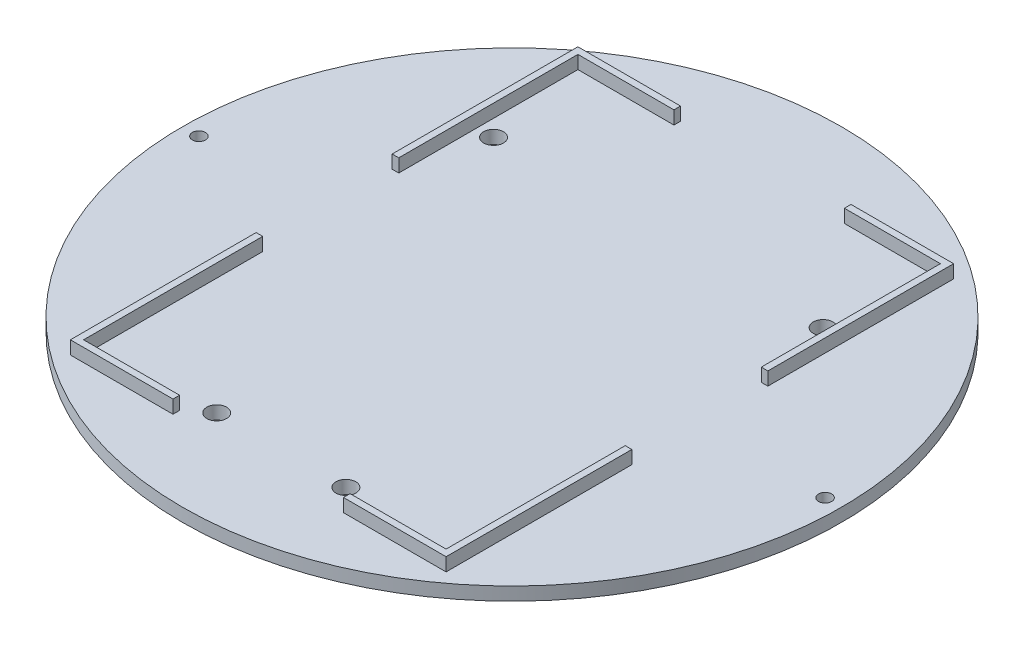
ISO-10303-21;
HEADER;
FILE_DESCRIPTION(('STEP AP214'),'2;1');
FILE_NAME('part.step','',(''),(''),'','','');
FILE_SCHEMA(('AUTOMOTIVE_DESIGN { 1 0 10303 214 1 1 1 1 }'));
ENDSEC;
DATA;
#1=APPLICATION_CONTEXT('core data for automotive mechanical design processes');
#2=APPLICATION_PROTOCOL_DEFINITION('international standard','automotive_design',2000,#1);
#3=PRODUCT_CONTEXT('',#1,'mechanical');
#4=PRODUCT('Part','Part','',(#3));
#5=PRODUCT_RELATED_PRODUCT_CATEGORY('part','',(#4));
#6=PRODUCT_DEFINITION_FORMATION('','',#4);
#7=PRODUCT_DEFINITION_CONTEXT('part definition',#1,'design');
#8=PRODUCT_DEFINITION('design','',#6,#7);
#9=PRODUCT_DEFINITION_SHAPE('','',#8);
#10=(LENGTH_UNIT() NAMED_UNIT(*) SI_UNIT(.MILLI.,.METRE.));
#11=(NAMED_UNIT(*) PLANE_ANGLE_UNIT() SI_UNIT($,.RADIAN.));
#12=(NAMED_UNIT(*) SI_UNIT($,.STERADIAN.) SOLID_ANGLE_UNIT());
#13=UNCERTAINTY_MEASURE_WITH_UNIT(LENGTH_MEASURE(1.E-05),#10,'distance_accuracy_value','');
#14=(GEOMETRIC_REPRESENTATION_CONTEXT(3) GLOBAL_UNCERTAINTY_ASSIGNED_CONTEXT((#13)) GLOBAL_UNIT_ASSIGNED_CONTEXT((#10,
#11,#12)) REPRESENTATION_CONTEXT('',''));
#15=CARTESIAN_POINT('',(0.,0.,0.));
#16=DIRECTION('',(0.,0.,1.));
#17=DIRECTION('',(1.,0.,0.));
#18=AXIS2_PLACEMENT_3D('',#15,#16,#17);
#19=CARTESIAN_POINT('',(0.,4.,0.));
#20=DIRECTION('',(0.,-1.,0.));
#21=DIRECTION('',(0.,0.,-1.));
#22=AXIS2_PLACEMENT_3D('',#19,#20,#21);
#23=PLANE('',#22);
#24=DIRECTION('',(1.,0.,0.));
#25=VECTOR('',#24,1.);
#26=CARTESIAN_POINT('',(-27.5,4.,37.5));
#27=LINE('',#26,#25);
#28=CARTESIAN_POINT('',(12.9330413510101,4.,37.5));
#29=VERTEX_POINT('',#28);
#30=CARTESIAN_POINT('',(27.5,4.,37.5));
#31=VERTEX_POINT('',#30);
#32=EDGE_CURVE('E430',#29,#31,#27,.T.);
#33=ORIENTED_EDGE('',*,*,#32,.F.);
#34=DIRECTION('',(0.,0.,-1.));
#35=VECTOR('',#34,1.);
#36=CARTESIAN_POINT('',(12.9330413510101,4.,47.0176577194358));
#37=LINE('',#36,#35);
#38=CARTESIAN_POINT('',(12.9330413510101,4.,38.5));
#39=VERTEX_POINT('',#38);
#40=EDGE_CURVE('E404',#39,#29,#37,.T.);
#41=ORIENTED_EDGE('',*,*,#40,.F.);
#42=DIRECTION('',(1.,0.,0.));
#43=VECTOR('',#42,1.);
#44=CARTESIAN_POINT('',(-28.5,4.,38.5));
#45=LINE('',#44,#43);
#46=CARTESIAN_POINT('',(28.5,4.,38.5));
#47=VERTEX_POINT('',#46);
#48=EDGE_CURVE('E394',#39,#47,#45,.T.);
#49=ORIENTED_EDGE('',*,*,#48,.T.);
#50=DIRECTION('',(0.,0.,-1.));
#51=VECTOR('',#50,1.);
#52=CARTESIAN_POINT('',(28.5,4.,38.5));
#53=LINE('',#52,#51);
#54=CARTESIAN_POINT('',(28.5,4.,10.3209492554859));
#55=VERTEX_POINT('',#54);
#56=EDGE_CURVE('E223',#47,#55,#53,.T.);
#57=ORIENTED_EDGE('',*,*,#56,.T.);
#58=DIRECTION('',(1.,0.,0.));
#59=VECTOR('',#58,1.);
#60=CARTESIAN_POINT('',(-42.3668595981365,4.,10.3209492554859));
#61=LINE('',#60,#59);
#62=CARTESIAN_POINT('',(27.5,4.,10.3209492554859));
#63=VERTEX_POINT('',#62);
#64=EDGE_CURVE('E446',#63,#55,#61,.T.);
#65=ORIENTED_EDGE('',*,*,#64,.F.);
#66=DIRECTION('',(0.,0.,-1.));
#67=VECTOR('',#66,1.);
#68=CARTESIAN_POINT('',(27.5,4.,37.5));
#69=LINE('',#68,#67);
#70=EDGE_CURVE('E421',#31,#63,#69,.T.);
#71=ORIENTED_EDGE('',*,*,#70,.F.);
#72=EDGE_LOOP('',(#33,#41,#49,#57,#65,#71));
#73=FACE_BOUND('',#72,.T.);
#74=ADVANCED_FACE('F37',(#73),#23,.F.);
#75=DIRECTION('',(-1.,0.,0.));
#76=VECTOR('',#75,1.);
#77=CARTESIAN_POINT('',(-28.5,4.,-38.5));
#78=LINE('',#77,#76);
#79=CARTESIAN_POINT('',(28.5,4.,-38.5));
#80=VERTEX_POINT('',#79);
#81=CARTESIAN_POINT('',(12.9330413510101,4.,-38.5));
#82=VERTEX_POINT('',#81);
#83=EDGE_CURVE('E222',#80,#82,#78,.T.);
#84=ORIENTED_EDGE('',*,*,#83,.T.);
#85=CARTESIAN_POINT('',(12.9330413510101,4.,-37.5));
#86=VERTEX_POINT('',#85);
#87=EDGE_CURVE('E493',#86,#82,#37,.T.);
#88=ORIENTED_EDGE('',*,*,#87,.F.);
#89=DIRECTION('',(-1.,0.,0.));
#90=VECTOR('',#89,1.);
#91=CARTESIAN_POINT('',(-27.5,4.,-37.5));
#92=LINE('',#91,#90);
#93=CARTESIAN_POINT('',(27.5,4.,-37.5));
#94=VERTEX_POINT('',#93);
#95=EDGE_CURVE('E424',#94,#86,#92,.T.);
#96=ORIENTED_EDGE('',*,*,#95,.F.);
#97=CARTESIAN_POINT('',(27.5,4.,-10.3209492554859));
#98=VERTEX_POINT('',#97);
#99=EDGE_CURVE('E380',#98,#94,#69,.T.);
#100=ORIENTED_EDGE('',*,*,#99,.F.);
#101=DIRECTION('',(-1.,0.,0.));
#102=VECTOR('',#101,1.);
#103=CARTESIAN_POINT('',(-42.3668595981365,4.,-10.3209492554859));
#104=LINE('',#103,#102);
#105=CARTESIAN_POINT('',(28.5,4.,-10.3209492554859));
#106=VERTEX_POINT('',#105);
#107=EDGE_CURVE('E448',#106,#98,#104,.T.);
#108=ORIENTED_EDGE('',*,*,#107,.F.);
#109=EDGE_CURVE('E227',#106,#80,#53,.T.);
#110=ORIENTED_EDGE('',*,*,#109,.T.);
#111=EDGE_LOOP('',(#84,#88,#96,#100,#108,#110));
#112=FACE_BOUND('',#111,.T.);
#113=ADVANCED_FACE('F281',(#112),#23,.F.);
#114=CARTESIAN_POINT('',(-28.5,4.,38.5));
#115=DIRECTION('',(0.,0.,-1.));
#116=DIRECTION('',(-1.,0.,0.));
#117=AXIS2_PLACEMENT_3D('',#114,#115,#116);
#118=PLANE('',#117);
#119=ORIENTED_EDGE('',*,*,#48,.F.);
#120=DIRECTION('',(0.,-1.,0.));
#121=VECTOR('',#120,1.);
#122=CARTESIAN_POINT('',(12.9330413510101,4.,38.5));
#123=LINE('',#122,#121);
#124=CARTESIAN_POINT('',(12.9330413510101,2.,38.5));
#125=VERTEX_POINT('',#124);
#126=EDGE_CURVE('E480',#39,#125,#123,.T.);
#127=ORIENTED_EDGE('',*,*,#126,.T.);
#128=DIRECTION('',(1.,0.,0.));
#129=VECTOR('',#128,1.);
#130=CARTESIAN_POINT('',(-28.5,2.,38.5));
#131=LINE('',#130,#129);
#132=CARTESIAN_POINT('',(28.5,2.,38.5));
#133=VERTEX_POINT('',#132);
#134=EDGE_CURVE('E234',#125,#133,#131,.T.);
#135=ORIENTED_EDGE('',*,*,#134,.T.);
#136=DIRECTION('',(0.,-1.,0.));
#137=VECTOR('',#136,1.);
#138=CARTESIAN_POINT('',(28.5,4.,38.5));
#139=LINE('',#138,#137);
#140=EDGE_CURVE('E252',#47,#133,#139,.T.);
#141=ORIENTED_EDGE('',*,*,#140,.F.);
#142=EDGE_LOOP('',(#119,#127,#135,#141));
#143=FACE_BOUND('',#142,.T.);
#144=ADVANCED_FACE('F286',(#143),#118,.F.);
#145=CARTESIAN_POINT('',(-28.5,4.,-38.5));
#146=DIRECTION('',(0.,0.,1.));
#147=DIRECTION('',(1.,0.,0.));
#148=AXIS2_PLACEMENT_3D('',#145,#146,#147);
#149=PLANE('',#148);
#150=DIRECTION('',(-1.,0.,0.));
#151=VECTOR('',#150,1.);
#152=CARTESIAN_POINT('',(-28.5,2.,-38.5));
#153=LINE('',#152,#151);
#154=CARTESIAN_POINT('',(28.5,2.,-38.5));
#155=VERTEX_POINT('',#154);
#156=CARTESIAN_POINT('',(12.9330413510101,2.,-38.5));
#157=VERTEX_POINT('',#156);
#158=EDGE_CURVE('E244',#155,#157,#153,.T.);
#159=ORIENTED_EDGE('',*,*,#158,.T.);
#160=DIRECTION('',(0.,1.,0.));
#161=VECTOR('',#160,1.);
#162=CARTESIAN_POINT('',(12.9330413510101,4.,-38.5));
#163=LINE('',#162,#161);
#164=EDGE_CURVE('E482',#157,#82,#163,.T.);
#165=ORIENTED_EDGE('',*,*,#164,.T.);
#166=ORIENTED_EDGE('',*,*,#83,.F.);
#167=DIRECTION('',(0.,-1.,0.));
#168=VECTOR('',#167,1.);
#169=CARTESIAN_POINT('',(28.5,4.,-38.5));
#170=LINE('',#169,#168);
#171=EDGE_CURVE('E249',#80,#155,#170,.T.);
#172=ORIENTED_EDGE('',*,*,#171,.T.);
#173=EDGE_LOOP('',(#159,#165,#166,#172));
#174=FACE_BOUND('',#173,.T.);
#175=ADVANCED_FACE('F296',(#174),#149,.F.);
#176=CARTESIAN_POINT('',(-27.5,4.,-37.5));
#177=DIRECTION('',(0.,0.,1.));
#178=DIRECTION('',(1.,0.,0.));
#179=AXIS2_PLACEMENT_3D('',#176,#177,#178);
#180=PLANE('',#179);
#181=DIRECTION('',(0.,1.,0.));
#182=VECTOR('',#181,1.);
#183=CARTESIAN_POINT('',(12.9330413510101,4.,-37.5));
#184=LINE('',#183,#182);
#185=CARTESIAN_POINT('',(12.9330413510101,2.,-37.5));
#186=VERTEX_POINT('',#185);
#187=EDGE_CURVE('E485',#186,#86,#184,.T.);
#188=ORIENTED_EDGE('',*,*,#187,.F.);
#189=DIRECTION('',(-1.,0.,0.));
#190=VECTOR('',#189,1.);
#191=CARTESIAN_POINT('',(-27.5,2.,-37.5));
#192=LINE('',#191,#190);
#193=CARTESIAN_POINT('',(27.5,2.,-37.5));
#194=VERTEX_POINT('',#193);
#195=EDGE_CURVE('E358',#194,#186,#192,.T.);
#196=ORIENTED_EDGE('',*,*,#195,.F.);
#197=DIRECTION('',(0.,-1.,0.));
#198=VECTOR('',#197,1.);
#199=CARTESIAN_POINT('',(27.5,4.,-37.5));
#200=LINE('',#199,#198);
#201=EDGE_CURVE('E391',#94,#194,#200,.T.);
#202=ORIENTED_EDGE('',*,*,#201,.F.);
#203=ORIENTED_EDGE('',*,*,#95,.T.);
#204=EDGE_LOOP('',(#188,#196,#202,#203));
#205=FACE_BOUND('',#204,.T.);
#206=ADVANCED_FACE('F565',(#205),#180,.T.);
#207=CARTESIAN_POINT('',(-27.5,4.,37.5));
#208=DIRECTION('',(0.,0.,-1.));
#209=DIRECTION('',(-1.,0.,0.));
#210=AXIS2_PLACEMENT_3D('',#207,#208,#209);
#211=PLANE('',#210);
#212=DIRECTION('',(0.,-1.,0.));
#213=VECTOR('',#212,1.);
#214=CARTESIAN_POINT('',(12.9330413510101,4.,37.5));
#215=LINE('',#214,#213);
#216=CARTESIAN_POINT('',(12.9330413510101,2.,37.5));
#217=VERTEX_POINT('',#216);
#218=EDGE_CURVE('E439',#29,#217,#215,.T.);
#219=ORIENTED_EDGE('',*,*,#218,.F.);
#220=ORIENTED_EDGE('',*,*,#32,.T.);
#221=DIRECTION('',(0.,-1.,0.));
#222=VECTOR('',#221,1.);
#223=CARTESIAN_POINT('',(27.5,4.,37.5));
#224=LINE('',#223,#222);
#225=CARTESIAN_POINT('',(27.5,2.,37.5));
#226=VERTEX_POINT('',#225);
#227=EDGE_CURVE('E381',#31,#226,#224,.T.);
#228=ORIENTED_EDGE('',*,*,#227,.T.);
#229=DIRECTION('',(1.,0.,0.));
#230=VECTOR('',#229,1.);
#231=CARTESIAN_POINT('',(-27.5,2.,37.5));
#232=LINE('',#231,#230);
#233=EDGE_CURVE('E377',#217,#226,#232,.T.);
#234=ORIENTED_EDGE('',*,*,#233,.F.);
#235=EDGE_LOOP('',(#219,#220,#228,#234));
#236=FACE_BOUND('',#235,.T.);
#237=ADVANCED_FACE('F323',(#236),#211,.T.);
#238=CARTESIAN_POINT('',(-28.5,4.,38.5));
#239=VERTEX_POINT('',#238);
#240=CARTESIAN_POINT('',(-12.9330413510101,4.,38.5));
#241=VERTEX_POINT('',#240);
#242=EDGE_CURVE('E395',#239,#241,#45,.T.);
#243=ORIENTED_EDGE('',*,*,#242,.T.);
#244=DIRECTION('',(0.,0.,1.));
#245=VECTOR('',#244,1.);
#246=CARTESIAN_POINT('',(-12.9330413510101,4.,47.0176577194358));
#247=LINE('',#246,#245);
#248=CARTESIAN_POINT('',(-12.9330413510101,4.,37.5));
#249=VERTEX_POINT('',#248);
#250=EDGE_CURVE('E216',#249,#241,#247,.T.);
#251=ORIENTED_EDGE('',*,*,#250,.F.);
#252=CARTESIAN_POINT('',(-27.5,4.,37.5));
#253=VERTEX_POINT('',#252);
#254=EDGE_CURVE('E385',#253,#249,#27,.T.);
#255=ORIENTED_EDGE('',*,*,#254,.F.);
#256=DIRECTION('',(0.,0.,1.));
#257=VECTOR('',#256,1.);
#258=CARTESIAN_POINT('',(-27.5,4.,37.5));
#259=LINE('',#258,#257);
#260=CARTESIAN_POINT('',(-27.5,4.,10.3209492554859));
#261=VERTEX_POINT('',#260);
#262=EDGE_CURVE('E427',#261,#253,#259,.T.);
#263=ORIENTED_EDGE('',*,*,#262,.F.);
#264=CARTESIAN_POINT('',(-28.5,4.,10.3209492554859));
#265=VERTEX_POINT('',#264);
#266=EDGE_CURVE('E447',#265,#261,#61,.T.);
#267=ORIENTED_EDGE('',*,*,#266,.F.);
#268=DIRECTION('',(0.,0.,1.));
#269=VECTOR('',#268,1.);
#270=CARTESIAN_POINT('',(-28.5,4.,38.5));
#271=LINE('',#270,#269);
#272=EDGE_CURVE('E247',#265,#239,#271,.T.);
#273=ORIENTED_EDGE('',*,*,#272,.T.);
#274=EDGE_LOOP('',(#243,#251,#255,#263,#267,#273));
#275=FACE_BOUND('',#274,.T.);
#276=ADVANCED_FACE('F274',(#275),#23,.F.);
#277=CARTESIAN_POINT('',(-28.5,4.,38.5));
#278=DIRECTION('',(1.,0.,0.));
#279=DIRECTION('',(0.,0.,-1.));
#280=AXIS2_PLACEMENT_3D('',#277,#278,#279);
#281=PLANE('',#280);
#282=ORIENTED_EDGE('',*,*,#272,.F.);
#283=DIRECTION('',(0.,-1.,0.));
#284=VECTOR('',#283,1.);
#285=CARTESIAN_POINT('',(-28.5,4.,10.3209492554859));
#286=LINE('',#285,#284);
#287=CARTESIAN_POINT('',(-28.5,2.,10.3209492554859));
#288=VERTEX_POINT('',#287);
#289=EDGE_CURVE('E412',#265,#288,#286,.T.);
#290=ORIENTED_EDGE('',*,*,#289,.T.);
#291=DIRECTION('',(0.,0.,1.));
#292=VECTOR('',#291,1.);
#293=CARTESIAN_POINT('',(-28.5,2.,38.5));
#294=LINE('',#293,#292);
#295=CARTESIAN_POINT('',(-28.5,2.,38.5));
#296=VERTEX_POINT('',#295);
#297=EDGE_CURVE('E235',#288,#296,#294,.T.);
#298=ORIENTED_EDGE('',*,*,#297,.T.);
#299=DIRECTION('',(0.,-1.,0.));
#300=VECTOR('',#299,1.);
#301=CARTESIAN_POINT('',(-28.5,4.,38.5));
#302=LINE('',#301,#300);
#303=EDGE_CURVE('E255',#239,#296,#302,.T.);
#304=ORIENTED_EDGE('',*,*,#303,.F.);
#305=EDGE_LOOP('',(#282,#290,#298,#304));
#306=FACE_BOUND('',#305,.T.);
#307=ADVANCED_FACE('F306',(#306),#281,.F.);
#308=CARTESIAN_POINT('',(28.5,4.,38.5));
#309=DIRECTION('',(-1.,0.,0.));
#310=DIRECTION('',(0.,0.,1.));
#311=AXIS2_PLACEMENT_3D('',#308,#309,#310);
#312=PLANE('',#311);
#313=DIRECTION('',(0.,0.,-1.));
#314=VECTOR('',#313,1.);
#315=CARTESIAN_POINT('',(28.5,2.,38.5));
#316=LINE('',#315,#314);
#317=CARTESIAN_POINT('',(28.5,2.,10.3209492554859));
#318=VERTEX_POINT('',#317);
#319=EDGE_CURVE('E240',#133,#318,#316,.T.);
#320=ORIENTED_EDGE('',*,*,#319,.T.);
#321=DIRECTION('',(0.,1.,0.));
#322=VECTOR('',#321,1.);
#323=CARTESIAN_POINT('',(28.5,4.,10.3209492554859));
#324=LINE('',#323,#322);
#325=EDGE_CURVE('E409',#318,#55,#324,.T.);
#326=ORIENTED_EDGE('',*,*,#325,.T.);
#327=ORIENTED_EDGE('',*,*,#56,.F.);
#328=ORIENTED_EDGE('',*,*,#140,.T.);
#329=EDGE_LOOP('',(#320,#326,#327,#328));
#330=FACE_BOUND('',#329,.T.);
#331=ADVANCED_FACE('F301',(#330),#312,.F.);
#332=CARTESIAN_POINT('',(27.5,4.,37.5));
#333=DIRECTION('',(-1.,0.,0.));
#334=DIRECTION('',(0.,0.,1.));
#335=AXIS2_PLACEMENT_3D('',#332,#333,#334);
#336=PLANE('',#335);
#337=DIRECTION('',(0.,1.,0.));
#338=VECTOR('',#337,1.);
#339=CARTESIAN_POINT('',(27.5,4.,10.3209492554859));
#340=LINE('',#339,#338);
#341=CARTESIAN_POINT('',(27.5,2.,10.3209492554859));
#342=VERTEX_POINT('',#341);
#343=EDGE_CURVE('E413',#342,#63,#340,.T.);
#344=ORIENTED_EDGE('',*,*,#343,.F.);
#345=DIRECTION('',(0.,0.,-1.));
#346=VECTOR('',#345,1.);
#347=CARTESIAN_POINT('',(27.5,2.,37.5));
#348=LINE('',#347,#346);
#349=EDGE_CURVE('E372',#226,#342,#348,.T.);
#350=ORIENTED_EDGE('',*,*,#349,.F.);
#351=ORIENTED_EDGE('',*,*,#227,.F.);
#352=ORIENTED_EDGE('',*,*,#70,.T.);
#353=EDGE_LOOP('',(#344,#350,#351,#352));
#354=FACE_BOUND('',#353,.T.);
#355=ADVANCED_FACE('F444',(#354),#336,.T.);
#356=CARTESIAN_POINT('',(-27.5,4.,37.5));
#357=DIRECTION('',(1.,0.,0.));
#358=DIRECTION('',(0.,0.,-1.));
#359=AXIS2_PLACEMENT_3D('',#356,#357,#358);
#360=PLANE('',#359);
#361=DIRECTION('',(0.,-1.,0.));
#362=VECTOR('',#361,1.);
#363=CARTESIAN_POINT('',(-27.5,4.,10.3209492554859));
#364=LINE('',#363,#362);
#365=CARTESIAN_POINT('',(-27.5,2.,10.3209492554859));
#366=VERTEX_POINT('',#365);
#367=EDGE_CURVE('E417',#261,#366,#364,.T.);
#368=ORIENTED_EDGE('',*,*,#367,.F.);
#369=ORIENTED_EDGE('',*,*,#262,.T.);
#370=DIRECTION('',(0.,-1.,0.));
#371=VECTOR('',#370,1.);
#372=CARTESIAN_POINT('',(-27.5,4.,37.5));
#373=LINE('',#372,#371);
#374=CARTESIAN_POINT('',(-27.5,2.,37.5));
#375=VERTEX_POINT('',#374);
#376=EDGE_CURVE('E384',#253,#375,#373,.T.);
#377=ORIENTED_EDGE('',*,*,#376,.T.);
#378=DIRECTION('',(0.,0.,1.));
#379=VECTOR('',#378,1.);
#380=CARTESIAN_POINT('',(-27.5,2.,37.5));
#381=LINE('',#380,#379);
#382=EDGE_CURVE('E367',#366,#375,#381,.T.);
#383=ORIENTED_EDGE('',*,*,#382,.F.);
#384=EDGE_LOOP('',(#368,#369,#377,#383));
#385=FACE_BOUND('',#384,.T.);
#386=ADVANCED_FACE('F275',(#385),#360,.T.);
#387=CARTESIAN_POINT('',(0.,2.,0.));
#388=DIRECTION('',(0.,-1.,0.));
#389=DIRECTION('',(0.,0.,-1.));
#390=AXIS2_PLACEMENT_3D('',#387,#388,#389);
#391=CYLINDRICAL_SURFACE('',#390,50.);
#392=CARTESIAN_POINT('',(0.,2.,0.));
#393=DIRECTION('',(0.,1.,0.));
#394=DIRECTION('',(0.,0.,1.));
#395=AXIS2_PLACEMENT_3D('',#392,#393,#394);
#396=CIRCLE('',#395,50.);
#397=CARTESIAN_POINT('',(0.,2.,50.));
#398=VERTEX_POINT('',#397);
#399=EDGE_CURVE('E11',#398,#398,#396,.T.);
#400=ORIENTED_EDGE('',*,*,#399,.F.);
#401=EDGE_LOOP('',(#400));
#402=FACE_BOUND('',#401,.T.);
#403=CARTESIAN_POINT('',(0.,0.,0.));
#404=DIRECTION('',(0.,1.,0.));
#405=DIRECTION('',(0.,0.,1.));
#406=AXIS2_PLACEMENT_3D('',#403,#404,#405);
#407=CIRCLE('',#406,50.);
#408=CARTESIAN_POINT('',(0.,0.,50.));
#409=VERTEX_POINT('',#408);
#410=EDGE_CURVE('E41',#409,#409,#407,.T.);
#411=ORIENTED_EDGE('',*,*,#410,.T.);
#412=EDGE_LOOP('',(#411));
#413=FACE_BOUND('',#412,.T.);
#414=ADVANCED_FACE('F39',(#402,#413),#391,.T.);
#415=CARTESIAN_POINT('',(0.,0.,0.));
#416=DIRECTION('',(0.,1.,0.));
#417=DIRECTION('',(0.,0.,1.));
#418=AXIS2_PLACEMENT_3D('',#415,#416,#417);
#419=PLANE('',#418);
#420=CARTESIAN_POINT('',(-47.5,0.,0.));
#421=DIRECTION('',(0.,1.,0.));
#422=DIRECTION('',(0.,0.,1.));
#423=AXIS2_PLACEMENT_3D('',#420,#421,#422);
#424=CIRCLE('',#423,0.999999999999998);
#425=CARTESIAN_POINT('',(-47.5,0.,0.999999999999998));
#426=VERTEX_POINT('',#425);
#427=EDGE_CURVE('E512',#426,#426,#424,.T.);
#428=ORIENTED_EDGE('',*,*,#427,.T.);
#429=EDGE_LOOP('',(#428));
#430=FACE_BOUND('',#429,.T.);
#431=CARTESIAN_POINT('',(47.5,0.,0.));
#432=DIRECTION('',(0.,1.,0.));
#433=DIRECTION('',(0.,0.,1.));
#434=AXIS2_PLACEMENT_3D('',#431,#432,#433);
#435=CIRCLE('',#434,0.999999999999998);
#436=CARTESIAN_POINT('',(47.5,0.,0.999999999999998));
#437=VERTEX_POINT('',#436);
#438=EDGE_CURVE('E515',#437,#437,#435,.T.);
#439=ORIENTED_EDGE('',*,*,#438,.T.);
#440=EDGE_LOOP('',(#439));
#441=FACE_BOUND('',#440,.T.);
#442=CARTESIAN_POINT('',(25.,0.,-22.2));
#443=DIRECTION('',(0.,1.,0.));
#444=DIRECTION('',(0.,0.,1.));
#445=AXIS2_PLACEMENT_3D('',#442,#443,#444);
#446=CIRCLE('',#445,1.5);
#447=CARTESIAN_POINT('',(25.,0.,-20.7));
#448=VERTEX_POINT('',#447);
#449=EDGE_CURVE('E495',#448,#448,#446,.T.);
#450=ORIENTED_EDGE('',*,*,#449,.T.);
#451=EDGE_LOOP('',(#450));
#452=FACE_BOUND('',#451,.T.);
#453=CARTESIAN_POINT('',(-9.8,0.,35.));
#454=DIRECTION('',(0.,1.,0.));
#455=DIRECTION('',(0.,0.,1.));
#456=AXIS2_PLACEMENT_3D('',#453,#454,#455);
#457=CIRCLE('',#456,1.5);
#458=CARTESIAN_POINT('',(-9.8,0.,36.5));
#459=VERTEX_POINT('',#458);
#460=EDGE_CURVE('E500',#459,#459,#457,.T.);
#461=ORIENTED_EDGE('',*,*,#460,.T.);
#462=EDGE_LOOP('',(#461));
#463=FACE_BOUND('',#462,.T.);
#464=CARTESIAN_POINT('',(9.8,0.,35.));
#465=DIRECTION('',(0.,1.,0.));
#466=DIRECTION('',(0.,0.,1.));
#467=AXIS2_PLACEMENT_3D('',#464,#465,#466);
#468=CIRCLE('',#467,1.5);
#469=CARTESIAN_POINT('',(9.8,0.,36.5));
#470=VERTEX_POINT('',#469);
#471=EDGE_CURVE('E503',#470,#470,#468,.T.);
#472=ORIENTED_EDGE('',*,*,#471,.T.);
#473=EDGE_LOOP('',(#472));
#474=FACE_BOUND('',#473,.T.);
#475=CARTESIAN_POINT('',(-25.,0.,-22.2));
#476=DIRECTION('',(0.,1.,0.));
#477=DIRECTION('',(0.,0.,1.));
#478=AXIS2_PLACEMENT_3D('',#475,#476,#477);
#479=CIRCLE('',#478,1.5);
#480=CARTESIAN_POINT('',(-25.,0.,-20.7));
#481=VERTEX_POINT('',#480);
#482=EDGE_CURVE('E506',#481,#481,#479,.T.);
#483=ORIENTED_EDGE('',*,*,#482,.T.);
#484=EDGE_LOOP('',(#483));
#485=FACE_BOUND('',#484,.T.);
#486=ORIENTED_EDGE('',*,*,#410,.F.);
#487=EDGE_LOOP('',(#486));
#488=FACE_BOUND('',#487,.T.);
#489=ADVANCED_FACE('F265',(#430,#441,#452,#463,#474,#485,#488),#419,.F.);
#490=CARTESIAN_POINT('',(-12.9330413510101,4.,-37.5));
#491=VERTEX_POINT('',#490);
#492=CARTESIAN_POINT('',(-27.5,4.,-37.5));
#493=VERTEX_POINT('',#492);
#494=EDGE_CURVE('E214',#491,#493,#92,.T.);
#495=ORIENTED_EDGE('',*,*,#494,.F.);
#496=CARTESIAN_POINT('',(-12.9330413510101,4.,-38.5));
#497=VERTEX_POINT('',#496);
#498=EDGE_CURVE('E200',#497,#491,#247,.T.);
#499=ORIENTED_EDGE('',*,*,#498,.F.);
#500=CARTESIAN_POINT('',(-28.5,4.,-38.5));
#501=VERTEX_POINT('',#500);
#502=EDGE_CURVE('E211',#497,#501,#78,.T.);
#503=ORIENTED_EDGE('',*,*,#502,.T.);
#504=CARTESIAN_POINT('',(-28.5,4.,-10.3209492554859));
#505=VERTEX_POINT('',#504);
#506=EDGE_CURVE('E393',#501,#505,#271,.T.);
#507=ORIENTED_EDGE('',*,*,#506,.T.);
#508=CARTESIAN_POINT('',(-27.5,4.,-10.3209492554859));
#509=VERTEX_POINT('',#508);
#510=EDGE_CURVE('E451',#509,#505,#104,.T.);
#511=ORIENTED_EDGE('',*,*,#510,.F.);
#512=EDGE_CURVE('E428',#493,#509,#259,.T.);
#513=ORIENTED_EDGE('',*,*,#512,.F.);
#514=EDGE_LOOP('',(#495,#499,#503,#507,#511,#513));
#515=FACE_BOUND('',#514,.T.);
#516=ADVANCED_FACE('F209',(#515),#23,.F.);
#517=CARTESIAN_POINT('',(-28.5,2.,-38.5));
#518=VERTEX_POINT('',#517);
#519=CARTESIAN_POINT('',(-28.5,2.,-10.3209492554859));
#520=VERTEX_POINT('',#519);
#521=EDGE_CURVE('E231',#518,#520,#294,.T.);
#522=ORIENTED_EDGE('',*,*,#521,.T.);
#523=DIRECTION('',(0.,1.,0.));
#524=VECTOR('',#523,1.);
#525=CARTESIAN_POINT('',(-28.5,4.,-10.3209492554859));
#526=LINE('',#525,#524);
#527=EDGE_CURVE('E464',#520,#505,#526,.T.);
#528=ORIENTED_EDGE('',*,*,#527,.T.);
#529=ORIENTED_EDGE('',*,*,#506,.F.);
#530=DIRECTION('',(0.,-1.,0.));
#531=VECTOR('',#530,1.);
#532=CARTESIAN_POINT('',(-28.5,4.,-38.5));
#533=LINE('',#532,#531);
#534=EDGE_CURVE('E220',#501,#518,#533,.T.);
#535=ORIENTED_EDGE('',*,*,#534,.T.);
#536=EDGE_LOOP('',(#522,#528,#529,#535));
#537=FACE_BOUND('',#536,.T.);
#538=ADVANCED_FACE('F272',(#537),#281,.F.);
#539=CARTESIAN_POINT('',(-12.9330413510101,2.,38.5));
#540=VERTEX_POINT('',#539);
#541=EDGE_CURVE('E236',#296,#540,#131,.T.);
#542=ORIENTED_EDGE('',*,*,#541,.T.);
#543=DIRECTION('',(0.,1.,0.));
#544=VECTOR('',#543,1.);
#545=CARTESIAN_POINT('',(-12.9330413510101,4.,38.5));
#546=LINE('',#545,#544);
#547=EDGE_CURVE('E204',#540,#241,#546,.T.);
#548=ORIENTED_EDGE('',*,*,#547,.T.);
#549=ORIENTED_EDGE('',*,*,#242,.F.);
#550=ORIENTED_EDGE('',*,*,#303,.T.);
#551=EDGE_LOOP('',(#542,#548,#549,#550));
#552=FACE_BOUND('',#551,.T.);
#553=ADVANCED_FACE('F299',(#552),#118,.F.);
#554=ORIENTED_EDGE('',*,*,#109,.F.);
#555=DIRECTION('',(0.,-1.,0.));
#556=VECTOR('',#555,1.);
#557=CARTESIAN_POINT('',(28.5,4.,-10.3209492554859));
#558=LINE('',#557,#556);
#559=CARTESIAN_POINT('',(28.5,2.,-10.3209492554859));
#560=VERTEX_POINT('',#559);
#561=EDGE_CURVE('E461',#106,#560,#558,.T.);
#562=ORIENTED_EDGE('',*,*,#561,.T.);
#563=EDGE_CURVE('E239',#560,#155,#316,.T.);
#564=ORIENTED_EDGE('',*,*,#563,.T.);
#565=ORIENTED_EDGE('',*,*,#171,.F.);
#566=EDGE_LOOP('',(#554,#562,#564,#565));
#567=FACE_BOUND('',#566,.T.);
#568=ADVANCED_FACE('F295',(#567),#312,.F.);
#569=ORIENTED_EDGE('',*,*,#502,.F.);
#570=DIRECTION('',(0.,-1.,0.));
#571=VECTOR('',#570,1.);
#572=CARTESIAN_POINT('',(-12.9330413510101,4.,-38.5));
#573=LINE('',#572,#571);
#574=CARTESIAN_POINT('',(-12.9330413510101,2.,-38.5));
#575=VERTEX_POINT('',#574);
#576=EDGE_CURVE('E197',#497,#575,#573,.T.);
#577=ORIENTED_EDGE('',*,*,#576,.T.);
#578=EDGE_CURVE('E243',#575,#518,#153,.T.);
#579=ORIENTED_EDGE('',*,*,#578,.T.);
#580=ORIENTED_EDGE('',*,*,#534,.F.);
#581=EDGE_LOOP('',(#569,#577,#579,#580));
#582=FACE_BOUND('',#581,.T.);
#583=ADVANCED_FACE('F218',(#582),#149,.F.);
#584=DIRECTION('',(0.,-1.,0.));
#585=VECTOR('',#584,1.);
#586=CARTESIAN_POINT('',(27.5,4.,-10.3209492554859));
#587=LINE('',#586,#585);
#588=CARTESIAN_POINT('',(27.5,2.,-10.3209492554859));
#589=VERTEX_POINT('',#588);
#590=EDGE_CURVE('E457',#98,#589,#587,.T.);
#591=ORIENTED_EDGE('',*,*,#590,.F.);
#592=ORIENTED_EDGE('',*,*,#99,.T.);
#593=ORIENTED_EDGE('',*,*,#201,.T.);
#594=EDGE_CURVE('E362',#589,#194,#348,.T.);
#595=ORIENTED_EDGE('',*,*,#594,.F.);
#596=EDGE_LOOP('',(#591,#592,#593,#595));
#597=FACE_BOUND('',#596,.T.);
#598=ADVANCED_FACE('F291',(#597),#336,.T.);
#599=DIRECTION('',(0.,-1.,0.));
#600=VECTOR('',#599,1.);
#601=CARTESIAN_POINT('',(-12.9330413510101,4.,-37.5));
#602=LINE('',#601,#600);
#603=CARTESIAN_POINT('',(-12.9330413510101,2.,-37.5));
#604=VERTEX_POINT('',#603);
#605=EDGE_CURVE('E205',#491,#604,#602,.T.);
#606=ORIENTED_EDGE('',*,*,#605,.F.);
#607=ORIENTED_EDGE('',*,*,#494,.T.);
#608=DIRECTION('',(0.,-1.,0.));
#609=VECTOR('',#608,1.);
#610=CARTESIAN_POINT('',(-27.5,4.,-37.5));
#611=LINE('',#610,#609);
#612=CARTESIAN_POINT('',(-27.5,2.,-37.5));
#613=VERTEX_POINT('',#612);
#614=EDGE_CURVE('E388',#493,#613,#611,.T.);
#615=ORIENTED_EDGE('',*,*,#614,.T.);
#616=EDGE_CURVE('E368',#604,#613,#192,.T.);
#617=ORIENTED_EDGE('',*,*,#616,.F.);
#618=EDGE_LOOP('',(#606,#607,#615,#617));
#619=FACE_BOUND('',#618,.T.);
#620=ADVANCED_FACE('F561',(#619),#180,.T.);
#621=DIRECTION('',(0.,1.,0.));
#622=VECTOR('',#621,1.);
#623=CARTESIAN_POINT('',(-27.5,4.,-10.3209492554859));
#624=LINE('',#623,#622);
#625=CARTESIAN_POINT('',(-27.5,2.,-10.3209492554859));
#626=VERTEX_POINT('',#625);
#627=EDGE_CURVE('E455',#626,#509,#624,.T.);
#628=ORIENTED_EDGE('',*,*,#627,.F.);
#629=EDGE_CURVE('E370',#613,#626,#381,.T.);
#630=ORIENTED_EDGE('',*,*,#629,.F.);
#631=ORIENTED_EDGE('',*,*,#614,.F.);
#632=ORIENTED_EDGE('',*,*,#512,.T.);
#633=EDGE_LOOP('',(#628,#630,#631,#632));
#634=FACE_BOUND('',#633,.T.);
#635=ADVANCED_FACE('F320',(#634),#360,.T.);
#636=DIRECTION('',(0.,1.,0.));
#637=VECTOR('',#636,1.);
#638=CARTESIAN_POINT('',(-12.9330413510101,4.,37.5));
#639=LINE('',#638,#637);
#640=CARTESIAN_POINT('',(-12.9330413510101,2.,37.5));
#641=VERTEX_POINT('',#640);
#642=EDGE_CURVE('E491',#641,#249,#639,.T.);
#643=ORIENTED_EDGE('',*,*,#642,.F.);
#644=EDGE_CURVE('E378',#375,#641,#232,.T.);
#645=ORIENTED_EDGE('',*,*,#644,.F.);
#646=ORIENTED_EDGE('',*,*,#376,.F.);
#647=ORIENTED_EDGE('',*,*,#254,.T.);
#648=EDGE_LOOP('',(#643,#645,#646,#647));
#649=FACE_BOUND('',#648,.T.);
#650=ADVANCED_FACE('F310',(#649),#211,.T.);
#651=CARTESIAN_POINT('',(0.,2.,0.));
#652=DIRECTION('',(0.,1.,0.));
#653=DIRECTION('',(0.,0.,1.));
#654=AXIS2_PLACEMENT_3D('',#651,#652,#653);
#655=PLANE('',#654);
#656=CARTESIAN_POINT('',(-47.5,2.,0.));
#657=DIRECTION('',(0.,1.,0.));
#658=DIRECTION('',(0.,0.,1.));
#659=AXIS2_PLACEMENT_3D('',#656,#657,#658);
#660=CIRCLE('',#659,0.999999999999998);
#661=CARTESIAN_POINT('',(-47.5,2.,0.999999999999998));
#662=VERTEX_POINT('',#661);
#663=EDGE_CURVE('E327',#662,#662,#660,.T.);
#664=ORIENTED_EDGE('',*,*,#663,.F.);
#665=EDGE_LOOP('',(#664));
#666=FACE_BOUND('',#665,.T.);
#667=CARTESIAN_POINT('',(47.5,2.,0.));
#668=DIRECTION('',(0.,1.,0.));
#669=DIRECTION('',(0.,0.,-1.));
#670=AXIS2_PLACEMENT_3D('',#667,#668,#669);
#671=CIRCLE('',#670,0.999999999999998);
#672=CARTESIAN_POINT('',(47.5,2.,-0.999999999999998));
#673=VERTEX_POINT('',#672);
#674=EDGE_CURVE('E331',#673,#673,#671,.T.);
#675=ORIENTED_EDGE('',*,*,#674,.F.);
#676=EDGE_LOOP('',(#675));
#677=FACE_BOUND('',#676,.T.);
#678=CARTESIAN_POINT('',(25.,2.,-22.2));
#679=DIRECTION('',(0.,1.,0.));
#680=DIRECTION('',(0.,0.,1.));
#681=AXIS2_PLACEMENT_3D('',#678,#679,#680);
#682=CIRCLE('',#681,1.5);
#683=CARTESIAN_POINT('',(25.,2.,-20.7));
#684=VERTEX_POINT('',#683);
#685=EDGE_CURVE('E335',#684,#684,#682,.T.);
#686=ORIENTED_EDGE('',*,*,#685,.F.);
#687=EDGE_LOOP('',(#686));
#688=FACE_BOUND('',#687,.T.);
#689=CARTESIAN_POINT('',(-9.8,2.,35.));
#690=DIRECTION('',(0.,1.,0.));
#691=DIRECTION('',(0.,0.,-1.));
#692=AXIS2_PLACEMENT_3D('',#689,#690,#691);
#693=CIRCLE('',#692,1.5);
#694=CARTESIAN_POINT('',(-9.8,2.,33.5));
#695=VERTEX_POINT('',#694);
#696=EDGE_CURVE('E339',#695,#695,#693,.T.);
#697=ORIENTED_EDGE('',*,*,#696,.F.);
#698=EDGE_LOOP('',(#697));
#699=FACE_BOUND('',#698,.T.);
#700=CARTESIAN_POINT('',(9.8,2.,35.));
#701=DIRECTION('',(0.,1.,0.));
#702=DIRECTION('',(0.,0.,1.));
#703=AXIS2_PLACEMENT_3D('',#700,#701,#702);
#704=CIRCLE('',#703,1.5);
#705=CARTESIAN_POINT('',(9.8,2.,36.5));
#706=VERTEX_POINT('',#705);
#707=EDGE_CURVE('E343',#706,#706,#704,.T.);
#708=ORIENTED_EDGE('',*,*,#707,.F.);
#709=EDGE_LOOP('',(#708));
#710=FACE_BOUND('',#709,.T.);
#711=CARTESIAN_POINT('',(-25.,2.,-22.2));
#712=DIRECTION('',(0.,1.,0.));
#713=DIRECTION('',(0.,0.,-1.));
#714=AXIS2_PLACEMENT_3D('',#711,#712,#713);
#715=CIRCLE('',#714,1.5);
#716=CARTESIAN_POINT('',(-25.,2.,-23.7));
#717=VERTEX_POINT('',#716);
#718=EDGE_CURVE('E346',#717,#717,#715,.T.);
#719=ORIENTED_EDGE('',*,*,#718,.F.);
#720=EDGE_LOOP('',(#719));
#721=FACE_BOUND('',#720,.T.);
#722=ORIENTED_EDGE('',*,*,#134,.F.);
#723=DIRECTION('',(0.,0.,-1.));
#724=VECTOR('',#723,1.);
#725=CARTESIAN_POINT('',(12.9330413510101,2.,47.0176577194358));
#726=LINE('',#725,#724);
#727=EDGE_CURVE('E60',#125,#217,#726,.T.);
#728=ORIENTED_EDGE('',*,*,#727,.T.);
#729=ORIENTED_EDGE('',*,*,#233,.T.);
#730=ORIENTED_EDGE('',*,*,#349,.T.);
#731=DIRECTION('',(1.,0.,0.));
#732=VECTOR('',#731,1.);
#733=CARTESIAN_POINT('',(-42.3668595981365,2.,10.3209492554859));
#734=LINE('',#733,#732);
#735=EDGE_CURVE('E475',#342,#318,#734,.T.);
#736=ORIENTED_EDGE('',*,*,#735,.T.);
#737=ORIENTED_EDGE('',*,*,#319,.F.);
#738=EDGE_LOOP('',(#722,#728,#729,#730,#736,#737));
#739=FACE_BOUND('',#738,.T.);
#740=ORIENTED_EDGE('',*,*,#578,.F.);
#741=DIRECTION('',(0.,0.,1.));
#742=VECTOR('',#741,1.);
#743=CARTESIAN_POINT('',(-12.9330413510101,2.,47.0176577194358));
#744=LINE('',#743,#742);
#745=EDGE_CURVE('E52',#575,#604,#744,.T.);
#746=ORIENTED_EDGE('',*,*,#745,.T.);
#747=ORIENTED_EDGE('',*,*,#616,.T.);
#748=ORIENTED_EDGE('',*,*,#629,.T.);
#749=DIRECTION('',(-1.,0.,0.));
#750=VECTOR('',#749,1.);
#751=CARTESIAN_POINT('',(-42.3668595981365,2.,-10.3209492554859));
#752=LINE('',#751,#750);
#753=EDGE_CURVE('E450',#626,#520,#752,.T.);
#754=ORIENTED_EDGE('',*,*,#753,.T.);
#755=ORIENTED_EDGE('',*,*,#521,.F.);
#756=EDGE_LOOP('',(#740,#746,#747,#748,#754,#755));
#757=FACE_BOUND('',#756,.T.);
#758=EDGE_CURVE('E353',#641,#540,#744,.T.);
#759=ORIENTED_EDGE('',*,*,#758,.T.);
#760=ORIENTED_EDGE('',*,*,#541,.F.);
#761=ORIENTED_EDGE('',*,*,#297,.F.);
#762=EDGE_CURVE('E458',#288,#366,#734,.T.);
#763=ORIENTED_EDGE('',*,*,#762,.T.);
#764=ORIENTED_EDGE('',*,*,#382,.T.);
#765=ORIENTED_EDGE('',*,*,#644,.T.);
#766=EDGE_LOOP('',(#759,#760,#761,#763,#764,#765));
#767=FACE_BOUND('',#766,.T.);
#768=ORIENTED_EDGE('',*,*,#195,.T.);
#769=EDGE_CURVE('E215',#186,#157,#726,.T.);
#770=ORIENTED_EDGE('',*,*,#769,.T.);
#771=ORIENTED_EDGE('',*,*,#158,.F.);
#772=ORIENTED_EDGE('',*,*,#563,.F.);
#773=EDGE_CURVE('E476',#560,#589,#752,.T.);
#774=ORIENTED_EDGE('',*,*,#773,.T.);
#775=ORIENTED_EDGE('',*,*,#594,.T.);
#776=EDGE_LOOP('',(#768,#770,#771,#772,#774,#775));
#777=FACE_BOUND('',#776,.T.);
#778=ORIENTED_EDGE('',*,*,#399,.T.);
#779=EDGE_LOOP('',(#778));
#780=FACE_BOUND('',#779,.T.);
#781=ADVANCED_FACE('F307',(#666,#677,#688,#699,#710,#721,#739,#757,#767,#777,#780),#655,.T.);
#782=CARTESIAN_POINT('',(-42.3668595981365,2.,-10.3209492554859));
#783=DIRECTION('',(0.,0.,-1.));
#784=DIRECTION('',(-1.,0.,0.));
#785=AXIS2_PLACEMENT_3D('',#782,#783,#784);
#786=PLANE('',#785);
#787=ORIENTED_EDGE('',*,*,#753,.F.);
#788=ORIENTED_EDGE('',*,*,#627,.T.);
#789=ORIENTED_EDGE('',*,*,#510,.T.);
#790=ORIENTED_EDGE('',*,*,#527,.F.);
#791=EDGE_LOOP('',(#787,#788,#789,#790));
#792=FACE_BOUND('',#791,.T.);
#793=ADVANCED_FACE('F309',(#792),#786,.F.);
#794=CARTESIAN_POINT('',(-42.3668595981365,2.,10.3209492554859));
#795=DIRECTION('',(0.,0.,1.));
#796=DIRECTION('',(1.,0.,0.));
#797=AXIS2_PLACEMENT_3D('',#794,#795,#796);
#798=PLANE('',#797);
#799=ORIENTED_EDGE('',*,*,#266,.T.);
#800=ORIENTED_EDGE('',*,*,#367,.T.);
#801=ORIENTED_EDGE('',*,*,#762,.F.);
#802=ORIENTED_EDGE('',*,*,#289,.F.);
#803=EDGE_LOOP('',(#799,#800,#801,#802));
#804=FACE_BOUND('',#803,.T.);
#805=ADVANCED_FACE('F316',(#804),#798,.F.);
#806=ORIENTED_EDGE('',*,*,#735,.F.);
#807=ORIENTED_EDGE('',*,*,#343,.T.);
#808=ORIENTED_EDGE('',*,*,#64,.T.);
#809=ORIENTED_EDGE('',*,*,#325,.F.);
#810=EDGE_LOOP('',(#806,#807,#808,#809));
#811=FACE_BOUND('',#810,.T.);
#812=ADVANCED_FACE('F558',(#811),#798,.F.);
#813=ORIENTED_EDGE('',*,*,#107,.T.);
#814=ORIENTED_EDGE('',*,*,#590,.T.);
#815=ORIENTED_EDGE('',*,*,#773,.F.);
#816=ORIENTED_EDGE('',*,*,#561,.F.);
#817=EDGE_LOOP('',(#813,#814,#815,#816));
#818=FACE_BOUND('',#817,.T.);
#819=ADVANCED_FACE('F319',(#818),#786,.F.);
#820=CARTESIAN_POINT('',(-12.9330413510101,2.,47.0176577194358));
#821=DIRECTION('',(-1.,0.,0.));
#822=DIRECTION('',(0.,0.,1.));
#823=AXIS2_PLACEMENT_3D('',#820,#821,#822);
#824=PLANE('',#823);
#825=ORIENTED_EDGE('',*,*,#758,.F.);
#826=ORIENTED_EDGE('',*,*,#642,.T.);
#827=ORIENTED_EDGE('',*,*,#250,.T.);
#828=ORIENTED_EDGE('',*,*,#547,.F.);
#829=EDGE_LOOP('',(#825,#826,#827,#828));
#830=FACE_BOUND('',#829,.T.);
#831=ADVANCED_FACE('F548',(#830),#824,.F.);
#832=CARTESIAN_POINT('',(12.9330413510101,2.,47.0176577194358));
#833=DIRECTION('',(1.,0.,0.));
#834=DIRECTION('',(0.,0.,-1.));
#835=AXIS2_PLACEMENT_3D('',#832,#833,#834);
#836=PLANE('',#835);
#837=ORIENTED_EDGE('',*,*,#40,.T.);
#838=ORIENTED_EDGE('',*,*,#218,.T.);
#839=ORIENTED_EDGE('',*,*,#727,.F.);
#840=ORIENTED_EDGE('',*,*,#126,.F.);
#841=EDGE_LOOP('',(#837,#838,#839,#840));
#842=FACE_BOUND('',#841,.T.);
#843=ADVANCED_FACE('F551',(#842),#836,.F.);
#844=ORIENTED_EDGE('',*,*,#769,.F.);
#845=ORIENTED_EDGE('',*,*,#187,.T.);
#846=ORIENTED_EDGE('',*,*,#87,.T.);
#847=ORIENTED_EDGE('',*,*,#164,.F.);
#848=EDGE_LOOP('',(#844,#845,#846,#847));
#849=FACE_BOUND('',#848,.T.);
#850=ADVANCED_FACE('F555',(#849),#836,.F.);
#851=ORIENTED_EDGE('',*,*,#498,.T.);
#852=ORIENTED_EDGE('',*,*,#605,.T.);
#853=ORIENTED_EDGE('',*,*,#745,.F.);
#854=ORIENTED_EDGE('',*,*,#576,.F.);
#855=EDGE_LOOP('',(#851,#852,#853,#854));
#856=FACE_BOUND('',#855,.T.);
#857=ADVANCED_FACE('F199',(#856),#824,.F.);
#858=CARTESIAN_POINT('',(-25.,-10.,-22.2));
#859=DIRECTION('',(0.,1.,0.));
#860=DIRECTION('',(0.,0.,1.));
#861=AXIS2_PLACEMENT_3D('',#858,#859,#860);
#862=CYLINDRICAL_SURFACE('',#861,1.5);
#863=ORIENTED_EDGE('',*,*,#718,.T.);
#864=EDGE_LOOP('',(#863));
#865=FACE_BOUND('',#864,.T.);
#866=ORIENTED_EDGE('',*,*,#482,.F.);
#867=EDGE_LOOP('',(#866));
#868=FACE_BOUND('',#867,.T.);
#869=ADVANCED_FACE('F541',(#865,#868),#862,.F.);
#870=CARTESIAN_POINT('',(9.8,-10.,35.));
#871=DIRECTION('',(0.,1.,0.));
#872=DIRECTION('',(0.,0.,1.));
#873=AXIS2_PLACEMENT_3D('',#870,#871,#872);
#874=CYLINDRICAL_SURFACE('',#873,1.5);
#875=ORIENTED_EDGE('',*,*,#707,.T.);
#876=EDGE_LOOP('',(#875));
#877=FACE_BOUND('',#876,.T.);
#878=ORIENTED_EDGE('',*,*,#471,.F.);
#879=EDGE_LOOP('',(#878));
#880=FACE_BOUND('',#879,.T.);
#881=ADVANCED_FACE('F539',(#877,#880),#874,.F.);
#882=CARTESIAN_POINT('',(-9.8,-10.,35.));
#883=DIRECTION('',(0.,1.,0.));
#884=DIRECTION('',(0.,0.,1.));
#885=AXIS2_PLACEMENT_3D('',#882,#883,#884);
#886=CYLINDRICAL_SURFACE('',#885,1.5);
#887=ORIENTED_EDGE('',*,*,#696,.T.);
#888=EDGE_LOOP('',(#887));
#889=FACE_BOUND('',#888,.T.);
#890=ORIENTED_EDGE('',*,*,#460,.F.);
#891=EDGE_LOOP('',(#890));
#892=FACE_BOUND('',#891,.T.);
#893=ADVANCED_FACE('F535',(#889,#892),#886,.F.);
#894=CARTESIAN_POINT('',(25.,-10.,-22.2));
#895=DIRECTION('',(0.,1.,0.));
#896=DIRECTION('',(0.,0.,1.));
#897=AXIS2_PLACEMENT_3D('',#894,#895,#896);
#898=CYLINDRICAL_SURFACE('',#897,1.5);
#899=ORIENTED_EDGE('',*,*,#685,.T.);
#900=EDGE_LOOP('',(#899));
#901=FACE_BOUND('',#900,.T.);
#902=ORIENTED_EDGE('',*,*,#449,.F.);
#903=EDGE_LOOP('',(#902));
#904=FACE_BOUND('',#903,.T.);
#905=ADVANCED_FACE('F529',(#901,#904),#898,.F.);
#906=CARTESIAN_POINT('',(47.5,-8.15,0.));
#907=DIRECTION('',(0.,1.,0.));
#908=DIRECTION('',(0.,0.,1.));
#909=AXIS2_PLACEMENT_3D('',#906,#907,#908);
#910=CYLINDRICAL_SURFACE('',#909,0.999999999999998);
#911=ORIENTED_EDGE('',*,*,#674,.T.);
#912=EDGE_LOOP('',(#911));
#913=FACE_BOUND('',#912,.T.);
#914=ORIENTED_EDGE('',*,*,#438,.F.);
#915=EDGE_LOOP('',(#914));
#916=FACE_BOUND('',#915,.T.);
#917=ADVANCED_FACE('F523',(#913,#916),#910,.F.);
#918=CARTESIAN_POINT('',(-47.5,-8.15,0.));
#919=DIRECTION('',(0.,1.,0.));
#920=DIRECTION('',(0.,0.,1.));
#921=AXIS2_PLACEMENT_3D('',#918,#919,#920);
#922=CYLINDRICAL_SURFACE('',#921,0.999999999999998);
#923=ORIENTED_EDGE('',*,*,#663,.T.);
#924=EDGE_LOOP('',(#923));
#925=FACE_BOUND('',#924,.T.);
#926=ORIENTED_EDGE('',*,*,#427,.F.);
#927=EDGE_LOOP('',(#926));
#928=FACE_BOUND('',#927,.T.);
#929=ADVANCED_FACE('F520',(#925,#928),#922,.F.);
#930=CLOSED_SHELL('',(#74,#113,#144,#175,#206,#237,#276,#307,#331,#355,#386,#414,#489,#516,#538,
#553,#568,#583,#598,#620,#635,#650,#781,#793,#805,#812,#819,#831,#843,#850,#857,#869,#881,#893,
#905,#917,#929));
#931=MANIFOLD_SOLID_BREP('B2',#930);
#932=ADVANCED_BREP_SHAPE_REPRESENTATION('',(#18,#931),#14);
#933=SHAPE_DEFINITION_REPRESENTATION(#9,#932);
ENDSEC;
END-ISO-10303-21;
